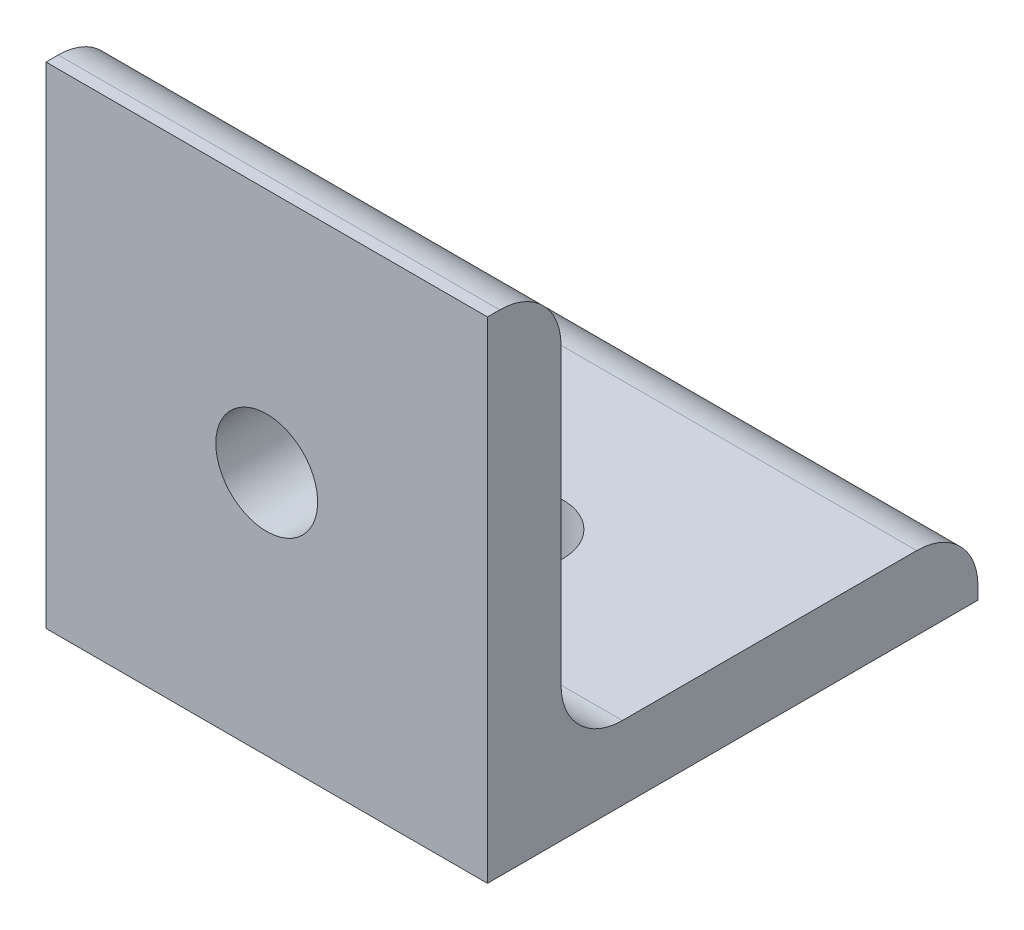
ISO-10303-21;
HEADER;
FILE_DESCRIPTION(('STEP AP214'),'2;1');
FILE_NAME('part.step','',(''),(''),'','','');
FILE_SCHEMA(('AUTOMOTIVE_DESIGN { 1 0 10303 214 1 1 1 1 }'));
ENDSEC;
DATA;
#1=APPLICATION_CONTEXT('core data for automotive mechanical design processes');
#2=APPLICATION_PROTOCOL_DEFINITION('international standard','automotive_design',2000,#1);
#3=PRODUCT_CONTEXT('',#1,'mechanical');
#4=PRODUCT('Part','Part','',(#3));
#5=PRODUCT_RELATED_PRODUCT_CATEGORY('part','',(#4));
#6=PRODUCT_DEFINITION_FORMATION('','',#4);
#7=PRODUCT_DEFINITION_CONTEXT('part definition',#1,'design');
#8=PRODUCT_DEFINITION('design','',#6,#7);
#9=PRODUCT_DEFINITION_SHAPE('','',#8);
#10=(LENGTH_UNIT() NAMED_UNIT(*) SI_UNIT(.MILLI.,.METRE.));
#11=(NAMED_UNIT(*) PLANE_ANGLE_UNIT() SI_UNIT($,.RADIAN.));
#12=(NAMED_UNIT(*) SI_UNIT($,.STERADIAN.) SOLID_ANGLE_UNIT());
#13=UNCERTAINTY_MEASURE_WITH_UNIT(LENGTH_MEASURE(1.E-05),#10,'distance_accuracy_value','');
#14=(GEOMETRIC_REPRESENTATION_CONTEXT(3) GLOBAL_UNCERTAINTY_ASSIGNED_CONTEXT((#13)) GLOBAL_UNIT_ASSIGNED_CONTEXT((#10,
#11,#12)) REPRESENTATION_CONTEXT('',''));
#15=CARTESIAN_POINT('',(0.,0.,0.));
#16=DIRECTION('',(0.,0.,1.));
#17=DIRECTION('',(1.,0.,0.));
#18=AXIS2_PLACEMENT_3D('',#15,#16,#17);
#19=CARTESIAN_POINT('',(18.,40.,0.));
#20=DIRECTION('',(0.,-1.,0.));
#21=DIRECTION('',(0.,0.,-1.));
#22=AXIS2_PLACEMENT_3D('',#19,#20,#21);
#23=PLANE('',#22);
#24=DIRECTION('',(0.,0.,1.));
#25=VECTOR('',#24,1.);
#26=CARTESIAN_POINT('',(18.,40.,0.));
#27=LINE('',#26,#25);
#28=CARTESIAN_POINT('',(18.,40.,-1.));
#29=VERTEX_POINT('',#28);
#30=CARTESIAN_POINT('',(18.,40.,0.));
#31=VERTEX_POINT('',#30);
#32=EDGE_CURVE('E113',#29,#31,#27,.T.);
#33=ORIENTED_EDGE('',*,*,#32,.F.);
#34=DIRECTION('',(-1.,0.,0.));
#35=VECTOR('',#34,1.);
#36=CARTESIAN_POINT('',(18.,40.,-1.));
#37=LINE('',#36,#35);
#38=CARTESIAN_POINT('',(-18.,40.,-1.));
#39=VERTEX_POINT('',#38);
#40=EDGE_CURVE('E162',#29,#39,#37,.T.);
#41=ORIENTED_EDGE('',*,*,#40,.T.);
#42=DIRECTION('',(0.,0.,1.));
#43=VECTOR('',#42,1.);
#44=CARTESIAN_POINT('',(-18.,40.,0.));
#45=LINE('',#44,#43);
#46=CARTESIAN_POINT('',(-18.,40.,0.));
#47=VERTEX_POINT('',#46);
#48=EDGE_CURVE('E139',#39,#47,#45,.T.);
#49=ORIENTED_EDGE('',*,*,#48,.T.);
#50=DIRECTION('',(-1.,0.,0.));
#51=VECTOR('',#50,1.);
#52=CARTESIAN_POINT('',(18.,40.,0.));
#53=LINE('',#52,#51);
#54=EDGE_CURVE('E131',#31,#47,#53,.T.);
#55=ORIENTED_EDGE('',*,*,#54,.F.);
#56=EDGE_LOOP('',(#33,#41,#49,#55));
#57=FACE_BOUND('',#56,.T.);
#58=ADVANCED_FACE('F41',(#57),#23,.F.);
#59=CARTESIAN_POINT('',(18.,40.,0.));
#60=DIRECTION('',(0.,0.,-1.));
#61=DIRECTION('',(-1.,0.,0.));
#62=AXIS2_PLACEMENT_3D('',#59,#60,#61);
#63=PLANE('',#62);
#64=CARTESIAN_POINT('',(0.,20.,0.));
#65=DIRECTION('',(0.,0.,-1.));
#66=DIRECTION('',(-1.,0.,0.));
#67=AXIS2_PLACEMENT_3D('',#64,#65,#66);
#68=CIRCLE('',#67,4.15);
#69=CARTESIAN_POINT('',(-4.15,20.,0.));
#70=VERTEX_POINT('',#69);
#71=EDGE_CURVE('E236',#70,#70,#68,.T.);
#72=ORIENTED_EDGE('',*,*,#71,.T.);
#73=EDGE_LOOP('',(#72));
#74=FACE_BOUND('',#73,.T.);
#75=DIRECTION('',(0.,-1.,0.));
#76=VECTOR('',#75,1.);
#77=CARTESIAN_POINT('',(-18.,40.,0.));
#78=LINE('',#77,#76);
#79=CARTESIAN_POINT('',(-18.,0.,0.));
#80=VERTEX_POINT('',#79);
#81=EDGE_CURVE('E212',#47,#80,#78,.T.);
#82=ORIENTED_EDGE('',*,*,#81,.T.);
#83=DIRECTION('',(-1.,0.,0.));
#84=VECTOR('',#83,1.);
#85=CARTESIAN_POINT('',(18.,0.,0.));
#86=LINE('',#85,#84);
#87=CARTESIAN_POINT('',(18.,0.,0.));
#88=VERTEX_POINT('',#87);
#89=EDGE_CURVE('E133',#88,#80,#86,.T.);
#90=ORIENTED_EDGE('',*,*,#89,.F.);
#91=DIRECTION('',(0.,-1.,0.));
#92=VECTOR('',#91,1.);
#93=CARTESIAN_POINT('',(18.,40.,0.));
#94=LINE('',#93,#92);
#95=EDGE_CURVE('E117',#31,#88,#94,.T.);
#96=ORIENTED_EDGE('',*,*,#95,.F.);
#97=ORIENTED_EDGE('',*,*,#54,.T.);
#98=EDGE_LOOP('',(#82,#90,#96,#97));
#99=FACE_BOUND('',#98,.T.);
#100=ADVANCED_FACE('F130',(#74,#99),#63,.F.);
#101=CARTESIAN_POINT('',(18.,0.,0.));
#102=DIRECTION('',(0.,1.,0.));
#103=DIRECTION('',(0.,0.,1.));
#104=AXIS2_PLACEMENT_3D('',#101,#102,#103);
#105=PLANE('',#104);
#106=CARTESIAN_POINT('',(0.,0.,-20.));
#107=DIRECTION('',(0.,1.,0.));
#108=DIRECTION('',(0.,0.,1.));
#109=AXIS2_PLACEMENT_3D('',#106,#107,#108);
#110=CIRCLE('',#109,4.15);
#111=CARTESIAN_POINT('',(0.,0.,-15.85));
#112=VERTEX_POINT('',#111);
#113=EDGE_CURVE('E213',#112,#112,#110,.T.);
#114=ORIENTED_EDGE('',*,*,#113,.T.);
#115=EDGE_LOOP('',(#114));
#116=FACE_BOUND('',#115,.T.);
#117=DIRECTION('',(0.,0.,-1.));
#118=VECTOR('',#117,1.);
#119=CARTESIAN_POINT('',(-18.,0.,0.));
#120=LINE('',#119,#118);
#121=CARTESIAN_POINT('',(-18.,0.,-40.));
#122=VERTEX_POINT('',#121);
#123=EDGE_CURVE('E216',#80,#122,#120,.T.);
#124=ORIENTED_EDGE('',*,*,#123,.T.);
#125=DIRECTION('',(-1.,0.,0.));
#126=VECTOR('',#125,1.);
#127=CARTESIAN_POINT('',(18.,0.,-40.));
#128=LINE('',#127,#126);
#129=CARTESIAN_POINT('',(18.,0.,-40.));
#130=VERTEX_POINT('',#129);
#131=EDGE_CURVE('E148',#130,#122,#128,.T.);
#132=ORIENTED_EDGE('',*,*,#131,.F.);
#133=DIRECTION('',(0.,0.,-1.));
#134=VECTOR('',#133,1.);
#135=CARTESIAN_POINT('',(18.,0.,0.));
#136=LINE('',#135,#134);
#137=EDGE_CURVE('E136',#88,#130,#136,.T.);
#138=ORIENTED_EDGE('',*,*,#137,.F.);
#139=ORIENTED_EDGE('',*,*,#89,.T.);
#140=EDGE_LOOP('',(#124,#132,#138,#139));
#141=FACE_BOUND('',#140,.T.);
#142=ADVANCED_FACE('F226',(#116,#141),#105,.F.);
#143=CARTESIAN_POINT('',(18.,6.,-40.));
#144=DIRECTION('',(0.,0.,1.));
#145=DIRECTION('',(1.,0.,0.));
#146=AXIS2_PLACEMENT_3D('',#143,#144,#145);
#147=PLANE('',#146);
#148=DIRECTION('',(0.,1.,0.));
#149=VECTOR('',#148,1.);
#150=CARTESIAN_POINT('',(-18.,6.,-40.));
#151=LINE('',#150,#149);
#152=CARTESIAN_POINT('',(-18.,1.,-40.));
#153=VERTEX_POINT('',#152);
#154=EDGE_CURVE('E191',#122,#153,#151,.T.);
#155=ORIENTED_EDGE('',*,*,#154,.T.);
#156=DIRECTION('',(-1.,0.,0.));
#157=VECTOR('',#156,1.);
#158=CARTESIAN_POINT('',(18.,1.,-40.));
#159=LINE('',#158,#157);
#160=CARTESIAN_POINT('',(18.,1.,-40.));
#161=VERTEX_POINT('',#160);
#162=EDGE_CURVE('E57',#153,#161,#159,.F.);
#163=ORIENTED_EDGE('',*,*,#162,.T.);
#164=DIRECTION('',(0.,1.,0.));
#165=VECTOR('',#164,1.);
#166=CARTESIAN_POINT('',(18.,6.,-40.));
#167=LINE('',#166,#165);
#168=EDGE_CURVE('E206',#130,#161,#167,.T.);
#169=ORIENTED_EDGE('',*,*,#168,.F.);
#170=ORIENTED_EDGE('',*,*,#131,.T.);
#171=EDGE_LOOP('',(#155,#163,#169,#170));
#172=FACE_BOUND('',#171,.T.);
#173=ADVANCED_FACE('F263',(#172),#147,.F.);
#174=CARTESIAN_POINT('',(18.,6.,-6.));
#175=DIRECTION('',(0.,-1.,0.));
#176=DIRECTION('',(0.,0.,-1.));
#177=AXIS2_PLACEMENT_3D('',#174,#175,#176);
#178=PLANE('',#177);
#179=CARTESIAN_POINT('',(0.,6.,-20.));
#180=DIRECTION('',(0.,1.,0.));
#181=DIRECTION('',(0.,0.,1.));
#182=AXIS2_PLACEMENT_3D('',#179,#180,#181);
#183=CIRCLE('',#182,4.15);
#184=CARTESIAN_POINT('',(0.,6.,-15.85));
#185=VERTEX_POINT('',#184);
#186=EDGE_CURVE('E232',#185,#185,#183,.T.);
#187=ORIENTED_EDGE('',*,*,#186,.F.);
#188=EDGE_LOOP('',(#187));
#189=FACE_BOUND('',#188,.T.);
#190=DIRECTION('',(0.,0.,1.));
#191=VECTOR('',#190,1.);
#192=CARTESIAN_POINT('',(-18.,6.,-6.));
#193=LINE('',#192,#191);
#194=CARTESIAN_POINT('',(-18.,6.,-35.));
#195=VERTEX_POINT('',#194);
#196=CARTESIAN_POINT('',(-18.,6.,-11.));
#197=VERTEX_POINT('',#196);
#198=EDGE_CURVE('E180',#195,#197,#193,.T.);
#199=ORIENTED_EDGE('',*,*,#198,.T.);
#200=DIRECTION('',(-1.,0.,0.));
#201=VECTOR('',#200,1.);
#202=CARTESIAN_POINT('',(18.,6.,-11.));
#203=LINE('',#202,#201);
#204=CARTESIAN_POINT('',(18.,6.,-11.));
#205=VERTEX_POINT('',#204);
#206=EDGE_CURVE('E159',#197,#205,#203,.F.);
#207=ORIENTED_EDGE('',*,*,#206,.T.);
#208=DIRECTION('',(0.,0.,1.));
#209=VECTOR('',#208,1.);
#210=CARTESIAN_POINT('',(18.,6.,-6.));
#211=LINE('',#210,#209);
#212=CARTESIAN_POINT('',(18.,6.,-35.));
#213=VERTEX_POINT('',#212);
#214=EDGE_CURVE('E197',#213,#205,#211,.T.);
#215=ORIENTED_EDGE('',*,*,#214,.F.);
#216=DIRECTION('',(-1.,0.,0.));
#217=VECTOR('',#216,1.);
#218=CARTESIAN_POINT('',(18.,6.,-35.));
#219=LINE('',#218,#217);
#220=EDGE_CURVE('E155',#213,#195,#219,.T.);
#221=ORIENTED_EDGE('',*,*,#220,.T.);
#222=EDGE_LOOP('',(#199,#207,#215,#221));
#223=FACE_BOUND('',#222,.T.);
#224=ADVANCED_FACE('F186',(#189,#223),#178,.F.);
#225=CARTESIAN_POINT('',(18.,40.,-6.));
#226=DIRECTION('',(0.,0.,1.));
#227=DIRECTION('',(1.,0.,0.));
#228=AXIS2_PLACEMENT_3D('',#225,#226,#227);
#229=PLANE('',#228);
#230=CARTESIAN_POINT('',(0.,20.,-6.));
#231=DIRECTION('',(0.,0.,-1.));
#232=DIRECTION('',(-1.,0.,0.));
#233=AXIS2_PLACEMENT_3D('',#230,#231,#232);
#234=CIRCLE('',#233,4.15);
#235=CARTESIAN_POINT('',(-4.15,20.,-6.));
#236=VERTEX_POINT('',#235);
#237=EDGE_CURVE('E240',#236,#236,#234,.T.);
#238=ORIENTED_EDGE('',*,*,#237,.F.);
#239=EDGE_LOOP('',(#238));
#240=FACE_BOUND('',#239,.T.);
#241=DIRECTION('',(0.,1.,0.));
#242=VECTOR('',#241,1.);
#243=CARTESIAN_POINT('',(18.,40.,-6.));
#244=LINE('',#243,#242);
#245=CARTESIAN_POINT('',(18.,11.,-6.));
#246=VERTEX_POINT('',#245);
#247=CARTESIAN_POINT('',(18.,35.,-6.));
#248=VERTEX_POINT('',#247);
#249=EDGE_CURVE('E196',#246,#248,#244,.T.);
#250=ORIENTED_EDGE('',*,*,#249,.F.);
#251=DIRECTION('',(-1.,0.,0.));
#252=VECTOR('',#251,1.);
#253=CARTESIAN_POINT('',(-18.,11.,-6.));
#254=LINE('',#253,#252);
#255=CARTESIAN_POINT('',(-18.,11.,-6.));
#256=VERTEX_POINT('',#255);
#257=EDGE_CURVE('E146',#246,#256,#254,.T.);
#258=ORIENTED_EDGE('',*,*,#257,.T.);
#259=DIRECTION('',(0.,1.,0.));
#260=VECTOR('',#259,1.);
#261=CARTESIAN_POINT('',(-18.,40.,-6.));
#262=LINE('',#261,#260);
#263=CARTESIAN_POINT('',(-18.,35.,-6.));
#264=VERTEX_POINT('',#263);
#265=EDGE_CURVE('E126',#256,#264,#262,.T.);
#266=ORIENTED_EDGE('',*,*,#265,.T.);
#267=DIRECTION('',(-1.,0.,0.));
#268=VECTOR('',#267,1.);
#269=CARTESIAN_POINT('',(18.,35.,-6.));
#270=LINE('',#269,#268);
#271=EDGE_CURVE('E142',#264,#248,#270,.F.);
#272=ORIENTED_EDGE('',*,*,#271,.T.);
#273=EDGE_LOOP('',(#250,#258,#266,#272));
#274=FACE_BOUND('',#273,.T.);
#275=ADVANCED_FACE('F199',(#240,#274),#229,.F.);
#276=CARTESIAN_POINT('',(18.,0.,0.));
#277=DIRECTION('',(-1.,0.,0.));
#278=DIRECTION('',(0.,0.,1.));
#279=AXIS2_PLACEMENT_3D('',#276,#277,#278);
#280=PLANE('',#279);
#281=ORIENTED_EDGE('',*,*,#249,.T.);
#282=CARTESIAN_POINT('',(18.,35.,-1.));
#283=DIRECTION('',(-1.,0.,0.));
#284=DIRECTION('',(0.,0.,1.));
#285=AXIS2_PLACEMENT_3D('',#282,#283,#284);
#286=CIRCLE('',#285,5.);
#287=EDGE_CURVE('E120',#248,#29,#286,.F.);
#288=ORIENTED_EDGE('',*,*,#287,.T.);
#289=ORIENTED_EDGE('',*,*,#32,.T.);
#290=ORIENTED_EDGE('',*,*,#95,.T.);
#291=ORIENTED_EDGE('',*,*,#137,.T.);
#292=ORIENTED_EDGE('',*,*,#168,.T.);
#293=CARTESIAN_POINT('',(18.,1.,-35.));
#294=DIRECTION('',(-1.,0.,0.));
#295=DIRECTION('',(0.,0.,1.));
#296=AXIS2_PLACEMENT_3D('',#293,#294,#295);
#297=CIRCLE('',#296,5.);
#298=EDGE_CURVE('E170',#161,#213,#297,.F.);
#299=ORIENTED_EDGE('',*,*,#298,.T.);
#300=ORIENTED_EDGE('',*,*,#214,.T.);
#301=CARTESIAN_POINT('',(18.,11.,-11.));
#302=DIRECTION('',(-1.,0.,0.));
#303=DIRECTION('',(0.,0.,1.));
#304=AXIS2_PLACEMENT_3D('',#301,#302,#303);
#305=CIRCLE('',#304,5.);
#306=EDGE_CURVE('E11',#205,#246,#305,.T.);
#307=ORIENTED_EDGE('',*,*,#306,.T.);
#308=EDGE_LOOP('',(#281,#288,#289,#290,#291,#292,#299,#300,#307));
#309=FACE_BOUND('',#308,.T.);
#310=ADVANCED_FACE('F116',(#309),#280,.F.);
#311=CARTESIAN_POINT('',(-18.,0.,0.));
#312=DIRECTION('',(-1.,0.,0.));
#313=DIRECTION('',(0.,0.,1.));
#314=AXIS2_PLACEMENT_3D('',#311,#312,#313);
#315=PLANE('',#314);
#316=ORIENTED_EDGE('',*,*,#48,.F.);
#317=CARTESIAN_POINT('',(-18.,35.,-1.));
#318=DIRECTION('',(-1.,0.,0.));
#319=DIRECTION('',(0.,0.,1.));
#320=AXIS2_PLACEMENT_3D('',#317,#318,#319);
#321=CIRCLE('',#320,5.);
#322=EDGE_CURVE('E167',#39,#264,#321,.T.);
#323=ORIENTED_EDGE('',*,*,#322,.T.);
#324=ORIENTED_EDGE('',*,*,#265,.F.);
#325=CARTESIAN_POINT('',(-18.,11.,-11.));
#326=DIRECTION('',(-1.,0.,0.));
#327=DIRECTION('',(0.,0.,1.));
#328=AXIS2_PLACEMENT_3D('',#325,#326,#327);
#329=CIRCLE('',#328,5.);
#330=EDGE_CURVE('E50',#256,#197,#329,.F.);
#331=ORIENTED_EDGE('',*,*,#330,.T.);
#332=ORIENTED_EDGE('',*,*,#198,.F.);
#333=CARTESIAN_POINT('',(-18.,1.,-35.));
#334=DIRECTION('',(-1.,0.,0.));
#335=DIRECTION('',(0.,0.,1.));
#336=AXIS2_PLACEMENT_3D('',#333,#334,#335);
#337=CIRCLE('',#336,5.);
#338=EDGE_CURVE('E65',#195,#153,#337,.T.);
#339=ORIENTED_EDGE('',*,*,#338,.T.);
#340=ORIENTED_EDGE('',*,*,#154,.F.);
#341=ORIENTED_EDGE('',*,*,#123,.F.);
#342=ORIENTED_EDGE('',*,*,#81,.F.);
#343=EDGE_LOOP('',(#316,#323,#324,#331,#332,#339,#340,#341,#342));
#344=FACE_BOUND('',#343,.T.);
#345=ADVANCED_FACE('F179',(#344),#315,.T.);
#346=CARTESIAN_POINT('',(0.,0.,-20.));
#347=DIRECTION('',(0.,1.,0.));
#348=DIRECTION('',(0.,0.,1.));
#349=AXIS2_PLACEMENT_3D('',#346,#347,#348);
#350=CYLINDRICAL_SURFACE('',#349,4.15);
#351=ORIENTED_EDGE('',*,*,#113,.F.);
#352=EDGE_LOOP('',(#351));
#353=FACE_BOUND('',#352,.T.);
#354=ORIENTED_EDGE('',*,*,#186,.T.);
#355=EDGE_LOOP('',(#354));
#356=FACE_BOUND('',#355,.T.);
#357=ADVANCED_FACE('F252',(#353,#356),#350,.F.);
#358=CARTESIAN_POINT('',(0.,20.,0.));
#359=DIRECTION('',(0.,0.,-1.));
#360=DIRECTION('',(-1.,0.,0.));
#361=AXIS2_PLACEMENT_3D('',#358,#359,#360);
#362=CYLINDRICAL_SURFACE('',#361,4.15);
#363=ORIENTED_EDGE('',*,*,#71,.F.);
#364=EDGE_LOOP('',(#363));
#365=FACE_BOUND('',#364,.T.);
#366=ORIENTED_EDGE('',*,*,#237,.T.);
#367=EDGE_LOOP('',(#366));
#368=FACE_BOUND('',#367,.T.);
#369=ADVANCED_FACE('F249',(#365,#368),#362,.F.);
#370=CARTESIAN_POINT('',(18.,11.,-11.));
#371=DIRECTION('',(1.,0.,0.));
#372=DIRECTION('',(0.,0.,-1.));
#373=AXIS2_PLACEMENT_3D('',#370,#371,#372);
#374=CYLINDRICAL_SURFACE('',#373,5.);
#375=ORIENTED_EDGE('',*,*,#306,.F.);
#376=ORIENTED_EDGE('',*,*,#206,.F.);
#377=ORIENTED_EDGE('',*,*,#330,.F.);
#378=ORIENTED_EDGE('',*,*,#257,.F.);
#379=EDGE_LOOP('',(#375,#376,#377,#378));
#380=FACE_BOUND('',#379,.T.);
#381=ADVANCED_FACE('F194',(#380),#374,.F.);
#382=CARTESIAN_POINT('',(18.,35.,-1.));
#383=DIRECTION('',(-1.,0.,0.));
#384=DIRECTION('',(0.,0.,1.));
#385=AXIS2_PLACEMENT_3D('',#382,#383,#384);
#386=CYLINDRICAL_SURFACE('',#385,5.);
#387=ORIENTED_EDGE('',*,*,#287,.F.);
#388=ORIENTED_EDGE('',*,*,#271,.F.);
#389=ORIENTED_EDGE('',*,*,#322,.F.);
#390=ORIENTED_EDGE('',*,*,#40,.F.);
#391=EDGE_LOOP('',(#387,#388,#389,#390));
#392=FACE_BOUND('',#391,.T.);
#393=ADVANCED_FACE('F223',(#392),#386,.T.);
#394=CARTESIAN_POINT('',(18.,1.,-35.));
#395=DIRECTION('',(-1.,0.,0.));
#396=DIRECTION('',(0.,0.,1.));
#397=AXIS2_PLACEMENT_3D('',#394,#395,#396);
#398=CYLINDRICAL_SURFACE('',#397,5.);
#399=ORIENTED_EDGE('',*,*,#298,.F.);
#400=ORIENTED_EDGE('',*,*,#162,.F.);
#401=ORIENTED_EDGE('',*,*,#338,.F.);
#402=ORIENTED_EDGE('',*,*,#220,.F.);
#403=EDGE_LOOP('',(#399,#400,#401,#402));
#404=FACE_BOUND('',#403,.T.);
#405=ADVANCED_FACE('F43',(#404),#398,.T.);
#406=CLOSED_SHELL('',(#58,#100,#142,#173,#224,#275,#310,#345,#357,#369,#381,#393,#405));
#407=MANIFOLD_SOLID_BREP('B2',#406);
#408=ADVANCED_BREP_SHAPE_REPRESENTATION('',(#18,#407),#14);
#409=SHAPE_DEFINITION_REPRESENTATION(#9,#408);
ENDSEC;
END-ISO-10303-21;
